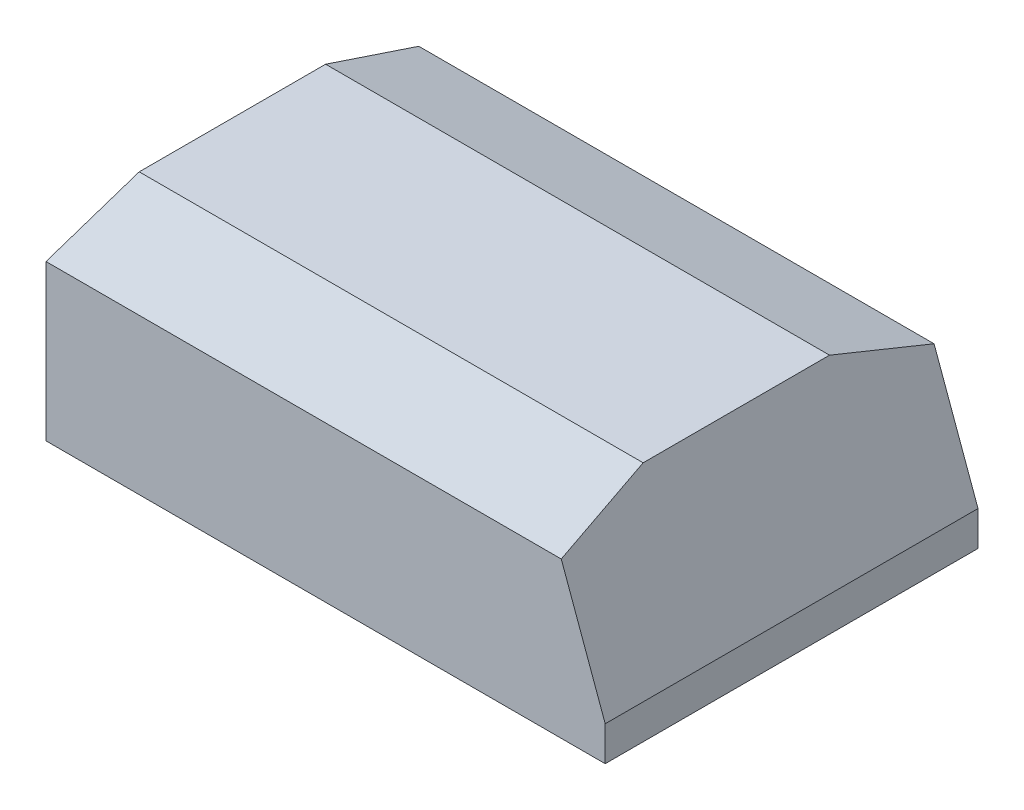
ISO-10303-21;
HEADER;
FILE_DESCRIPTION(('STEP AP214'),'2;1');
FILE_NAME('part.step','',(''),(''),'','','');
FILE_SCHEMA(('AUTOMOTIVE_DESIGN { 1 0 10303 214 1 1 1 1 }'));
ENDSEC;
DATA;
#1=APPLICATION_CONTEXT('core data for automotive mechanical design processes');
#2=APPLICATION_PROTOCOL_DEFINITION('international standard','automotive_design',2000,#1);
#3=PRODUCT_CONTEXT('',#1,'mechanical');
#4=PRODUCT('Part','Part','',(#3));
#5=PRODUCT_RELATED_PRODUCT_CATEGORY('part','',(#4));
#6=PRODUCT_DEFINITION_FORMATION('','',#4);
#7=PRODUCT_DEFINITION_CONTEXT('part definition',#1,'design');
#8=PRODUCT_DEFINITION('design','',#6,#7);
#9=PRODUCT_DEFINITION_SHAPE('','',#8);
#10=(LENGTH_UNIT() NAMED_UNIT(*) SI_UNIT(.MILLI.,.METRE.));
#11=(NAMED_UNIT(*) PLANE_ANGLE_UNIT() SI_UNIT($,.RADIAN.));
#12=(NAMED_UNIT(*) SI_UNIT($,.STERADIAN.) SOLID_ANGLE_UNIT());
#13=UNCERTAINTY_MEASURE_WITH_UNIT(LENGTH_MEASURE(1.E-05),#10,'distance_accuracy_value','');
#14=(GEOMETRIC_REPRESENTATION_CONTEXT(3) GLOBAL_UNCERTAINTY_ASSIGNED_CONTEXT((#13)) GLOBAL_UNIT_ASSIGNED_CONTEXT((#10,
#11,#12)) REPRESENTATION_CONTEXT('',''));
#15=CARTESIAN_POINT('',(0.,0.,0.));
#16=DIRECTION('',(0.,0.,1.));
#17=DIRECTION('',(1.,0.,0.));
#18=AXIS2_PLACEMENT_3D('',#15,#16,#17);
#19=CARTESIAN_POINT('',(45.,30.,-30.));
#20=DIRECTION('',(-1.,0.,0.));
#21=DIRECTION('',(0.,0.,1.));
#22=AXIS2_PLACEMENT_3D('',#19,#20,#21);
#23=PLANE('',#22);
#24=DIRECTION('',(0.,-1.,0.));
#25=VECTOR('',#24,1.);
#26=CARTESIAN_POINT('',(45.,30.,-30.));
#27=LINE('',#26,#25);
#28=CARTESIAN_POINT('',(45.,5.56799185956633,-30.));
#29=VERTEX_POINT('',#28);
#30=CARTESIAN_POINT('',(45.,0.,-30.));
#31=VERTEX_POINT('',#30);
#32=EDGE_CURVE('E137',#29,#31,#27,.T.);
#33=ORIENTED_EDGE('',*,*,#32,.F.);
#34=DIRECTION('',(0.,0.,1.));
#35=VECTOR('',#34,1.);
#36=CARTESIAN_POINT('',(45.,5.56799185956633,-30.));
#37=LINE('',#36,#35);
#38=CARTESIAN_POINT('',(45.,5.56799185956633,30.));
#39=VERTEX_POINT('',#38);
#40=EDGE_CURVE('E146',#29,#39,#37,.T.);
#41=ORIENTED_EDGE('',*,*,#40,.T.);
#42=DIRECTION('',(0.,-1.,0.));
#43=VECTOR('',#42,1.);
#44=CARTESIAN_POINT('',(45.,30.,30.));
#45=LINE('',#44,#43);
#46=CARTESIAN_POINT('',(45.,0.,30.));
#47=VERTEX_POINT('',#46);
#48=EDGE_CURVE('E120',#39,#47,#45,.T.);
#49=ORIENTED_EDGE('',*,*,#48,.T.);
#50=DIRECTION('',(0.,0.,-1.));
#51=VECTOR('',#50,1.);
#52=CARTESIAN_POINT('',(45.,0.,-30.));
#53=LINE('',#52,#51);
#54=EDGE_CURVE('E149',#47,#31,#53,.T.);
#55=ORIENTED_EDGE('',*,*,#54,.T.);
#56=EDGE_LOOP('',(#33,#41,#49,#55));
#57=FACE_BOUND('',#56,.T.);
#58=ADVANCED_FACE('F43',(#57),#23,.F.);
#59=CARTESIAN_POINT('',(-45.,30.,-30.));
#60=DIRECTION('',(0.,0.,1.));
#61=DIRECTION('',(1.,0.,0.));
#62=AXIS2_PLACEMENT_3D('',#59,#60,#61);
#63=PLANE('',#62);
#64=DIRECTION('',(0.,-1.,0.));
#65=VECTOR('',#64,1.);
#66=CARTESIAN_POINT('',(-45.,30.,-30.));
#67=LINE('',#66,#65);
#68=CARTESIAN_POINT('',(-45.,25.,-30.));
#69=VERTEX_POINT('',#68);
#70=CARTESIAN_POINT('',(-45.,0.,-30.));
#71=VERTEX_POINT('',#70);
#72=EDGE_CURVE('E135',#69,#71,#67,.T.);
#73=ORIENTED_EDGE('',*,*,#72,.F.);
#74=DIRECTION('',(-1.,0.,0.));
#75=VECTOR('',#74,1.);
#76=CARTESIAN_POINT('',(45.,25.,-30.));
#77=LINE('',#76,#75);
#78=CARTESIAN_POINT('',(37.9273274448638,25.,-30.));
#79=VERTEX_POINT('',#78);
#80=EDGE_CURVE('E175',#79,#69,#77,.T.);
#81=ORIENTED_EDGE('',*,*,#80,.F.);
#82=DIRECTION('',(0.342020143325663,-0.93969262078591,0.));
#83=VECTOR('',#82,1.);
#84=CARTESIAN_POINT('',(45.,5.56799185956633,-30.));
#85=LINE('',#84,#83);
#86=EDGE_CURVE('E144',#79,#29,#85,.T.);
#87=ORIENTED_EDGE('',*,*,#86,.T.);
#88=ORIENTED_EDGE('',*,*,#32,.T.);
#89=DIRECTION('',(-1.,0.,0.));
#90=VECTOR('',#89,1.);
#91=CARTESIAN_POINT('',(-45.,0.,-30.));
#92=LINE('',#91,#90);
#93=EDGE_CURVE('E130',#31,#71,#92,.T.);
#94=ORIENTED_EDGE('',*,*,#93,.T.);
#95=EDGE_LOOP('',(#73,#81,#87,#88,#94));
#96=FACE_BOUND('',#95,.T.);
#97=ADVANCED_FACE('F160',(#96),#63,.F.);
#98=CARTESIAN_POINT('',(-45.,30.,-30.));
#99=DIRECTION('',(1.,0.,0.));
#100=DIRECTION('',(0.,0.,-1.));
#101=AXIS2_PLACEMENT_3D('',#98,#99,#100);
#102=PLANE('',#101);
#103=DIRECTION('',(0.,-1.,0.));
#104=VECTOR('',#103,1.);
#105=CARTESIAN_POINT('',(-45.,30.,30.));
#106=LINE('',#105,#104);
#107=CARTESIAN_POINT('',(-45.,25.,30.));
#108=VERTEX_POINT('',#107);
#109=CARTESIAN_POINT('',(-45.,0.,30.));
#110=VERTEX_POINT('',#109);
#111=EDGE_CURVE('E115',#108,#110,#106,.T.);
#112=ORIENTED_EDGE('',*,*,#111,.F.);
#113=DIRECTION('',(0.,0.316227766016838,-0.948683298050514));
#114=VECTOR('',#113,1.);
#115=CARTESIAN_POINT('',(-45.,43.5,-25.5));
#116=LINE('',#115,#114);
#117=CARTESIAN_POINT('',(-45.,30.,15.));
#118=VERTEX_POINT('',#117);
#119=EDGE_CURVE('E103',#108,#118,#116,.T.);
#120=ORIENTED_EDGE('',*,*,#119,.T.);
#121=DIRECTION('',(0.,0.,1.));
#122=VECTOR('',#121,1.);
#123=CARTESIAN_POINT('',(-45.,30.,-30.));
#124=LINE('',#123,#122);
#125=CARTESIAN_POINT('',(-45.,30.,-15.));
#126=VERTEX_POINT('',#125);
#127=EDGE_CURVE('E46',#126,#118,#124,.T.);
#128=ORIENTED_EDGE('',*,*,#127,.F.);
#129=DIRECTION('',(0.,-0.316227766016838,-0.948683298050514));
#130=VECTOR('',#129,1.);
#131=CARTESIAN_POINT('',(-45.,25.5,-28.5));
#132=LINE('',#131,#130);
#133=EDGE_CURVE('E117',#126,#69,#132,.T.);
#134=ORIENTED_EDGE('',*,*,#133,.T.);
#135=ORIENTED_EDGE('',*,*,#72,.T.);
#136=DIRECTION('',(0.,0.,1.));
#137=VECTOR('',#136,1.);
#138=CARTESIAN_POINT('',(-45.,0.,-30.));
#139=LINE('',#138,#137);
#140=EDGE_CURVE('E124',#71,#110,#139,.T.);
#141=ORIENTED_EDGE('',*,*,#140,.T.);
#142=EDGE_LOOP('',(#112,#120,#128,#134,#135,#141));
#143=FACE_BOUND('',#142,.T.);
#144=ADVANCED_FACE('F112',(#143),#102,.F.);
#145=CARTESIAN_POINT('',(-45.,30.,30.));
#146=DIRECTION('',(0.,0.,-1.));
#147=DIRECTION('',(-1.,0.,0.));
#148=AXIS2_PLACEMENT_3D('',#145,#146,#147);
#149=PLANE('',#148);
#150=DIRECTION('',(0.342020143325663,-0.93969262078591,0.));
#151=VECTOR('',#150,1.);
#152=CARTESIAN_POINT('',(45.,5.56799185956633,30.));
#153=LINE('',#152,#151);
#154=CARTESIAN_POINT('',(37.9273274448638,25.,30.));
#155=VERTEX_POINT('',#154);
#156=EDGE_CURVE('E116',#155,#39,#153,.T.);
#157=ORIENTED_EDGE('',*,*,#156,.F.);
#158=DIRECTION('',(-1.,0.,0.));
#159=VECTOR('',#158,1.);
#160=CARTESIAN_POINT('',(45.,25.,30.));
#161=LINE('',#160,#159);
#162=EDGE_CURVE('E59',#155,#108,#161,.T.);
#163=ORIENTED_EDGE('',*,*,#162,.T.);
#164=ORIENTED_EDGE('',*,*,#111,.T.);
#165=DIRECTION('',(1.,0.,0.));
#166=VECTOR('',#165,1.);
#167=CARTESIAN_POINT('',(-45.,0.,30.));
#168=LINE('',#167,#166);
#169=EDGE_CURVE('E121',#110,#47,#168,.T.);
#170=ORIENTED_EDGE('',*,*,#169,.T.);
#171=ORIENTED_EDGE('',*,*,#48,.F.);
#172=EDGE_LOOP('',(#157,#163,#164,#170,#171));
#173=FACE_BOUND('',#172,.T.);
#174=ADVANCED_FACE('F179',(#173),#149,.F.);
#175=CARTESIAN_POINT('',(0.,30.,0.));
#176=DIRECTION('',(0.,1.,0.));
#177=DIRECTION('',(0.,0.,1.));
#178=AXIS2_PLACEMENT_3D('',#175,#176,#177);
#179=PLANE('',#178);
#180=DIRECTION('',(-1.,0.,0.));
#181=VECTOR('',#180,1.);
#182=CARTESIAN_POINT('',(45.,30.,15.));
#183=LINE('',#182,#181);
#184=CARTESIAN_POINT('',(36.1074762735328,30.,15.));
#185=VERTEX_POINT('',#184);
#186=EDGE_CURVE('E100',#185,#118,#183,.T.);
#187=ORIENTED_EDGE('',*,*,#186,.F.);
#188=DIRECTION('',(0.,0.,1.));
#189=VECTOR('',#188,1.);
#190=CARTESIAN_POINT('',(36.1074762735328,30.,-30.));
#191=LINE('',#190,#189);
#192=CARTESIAN_POINT('',(36.1074762735328,30.,-15.));
#193=VERTEX_POINT('',#192);
#194=EDGE_CURVE('E142',#193,#185,#191,.T.);
#195=ORIENTED_EDGE('',*,*,#194,.F.);
#196=DIRECTION('',(-1.,0.,0.));
#197=VECTOR('',#196,1.);
#198=CARTESIAN_POINT('',(45.,30.,-15.));
#199=LINE('',#198,#197);
#200=EDGE_CURVE('E66',#193,#126,#199,.T.);
#201=ORIENTED_EDGE('',*,*,#200,.T.);
#202=ORIENTED_EDGE('',*,*,#127,.T.);
#203=EDGE_LOOP('',(#187,#195,#201,#202));
#204=FACE_BOUND('',#203,.T.);
#205=ADVANCED_FACE('F119',(#204),#179,.T.);
#206=CARTESIAN_POINT('',(0.,0.,0.));
#207=DIRECTION('',(0.,1.,0.));
#208=DIRECTION('',(0.,0.,1.));
#209=AXIS2_PLACEMENT_3D('',#206,#207,#208);
#210=PLANE('',#209);
#211=ORIENTED_EDGE('',*,*,#54,.F.);
#212=ORIENTED_EDGE('',*,*,#169,.F.);
#213=ORIENTED_EDGE('',*,*,#140,.F.);
#214=ORIENTED_EDGE('',*,*,#93,.F.);
#215=EDGE_LOOP('',(#211,#212,#213,#214));
#216=FACE_BOUND('',#215,.T.);
#217=ADVANCED_FACE('F163',(#216),#210,.F.);
#218=CARTESIAN_POINT('',(45.,5.56799185956633,-30.));
#219=DIRECTION('',(-0.93969262078591,-0.342020143325663,0.));
#220=DIRECTION('',(0.342020143325663,-0.939692620785911,0.));
#221=AXIS2_PLACEMENT_3D('',#218,#219,#220);
#222=PLANE('',#221);
#223=ORIENTED_EDGE('',*,*,#194,.T.);
#224=DIRECTION('',(0.114342612853221,-0.314153746895672,0.942461240687015));
#225=VECTOR('',#224,1.);
#226=CARTESIAN_POINT('',(32.2520086467479,40.59281024603,-16.7784307380899));
#227=LINE('',#226,#225);
#228=EDGE_CURVE('E11',#185,#155,#227,.T.);
#229=ORIENTED_EDGE('',*,*,#228,.T.);
#230=ORIENTED_EDGE('',*,*,#156,.T.);
#231=ORIENTED_EDGE('',*,*,#40,.F.);
#232=ORIENTED_EDGE('',*,*,#86,.F.);
#233=DIRECTION('',(-0.114342612853221,0.314153746895672,0.942461240687015));
#234=VECTOR('',#233,1.);
#235=CARTESIAN_POINT('',(38.7178174931304,22.8281464420838,-36.5155606737486));
#236=LINE('',#235,#234);
#237=EDGE_CURVE('E52',#79,#193,#236,.T.);
#238=ORIENTED_EDGE('',*,*,#237,.T.);
#239=EDGE_LOOP('',(#223,#229,#230,#231,#232,#238));
#240=FACE_BOUND('',#239,.T.);
#241=ADVANCED_FACE('F141',(#240),#222,.F.);
#242=CARTESIAN_POINT('',(45.,30.,-15.));
#243=DIRECTION('',(0.,-0.948683298050514,0.316227766016838));
#244=DIRECTION('',(0.,-0.316227766016838,-0.948683298050514));
#245=AXIS2_PLACEMENT_3D('',#242,#243,#244);
#246=PLANE('',#245);
#247=ORIENTED_EDGE('',*,*,#200,.F.);
#248=ORIENTED_EDGE('',*,*,#237,.F.);
#249=ORIENTED_EDGE('',*,*,#80,.T.);
#250=ORIENTED_EDGE('',*,*,#133,.F.);
#251=EDGE_LOOP('',(#247,#248,#249,#250));
#252=FACE_BOUND('',#251,.T.);
#253=ADVANCED_FACE('F176',(#252),#246,.F.);
#254=CARTESIAN_POINT('',(45.,30.,15.));
#255=DIRECTION('',(0.,-0.948683298050514,-0.316227766016838));
#256=DIRECTION('',(0.,0.316227766016838,-0.948683298050514));
#257=AXIS2_PLACEMENT_3D('',#254,#255,#256);
#258=PLANE('',#257);
#259=ORIENTED_EDGE('',*,*,#162,.F.);
#260=ORIENTED_EDGE('',*,*,#228,.F.);
#261=ORIENTED_EDGE('',*,*,#186,.T.);
#262=ORIENTED_EDGE('',*,*,#119,.F.);
#263=EDGE_LOOP('',(#259,#260,#261,#262));
#264=FACE_BOUND('',#263,.T.);
#265=ADVANCED_FACE('F102',(#264),#258,.F.);
#266=CLOSED_SHELL('',(#58,#97,#144,#174,#205,#217,#241,#253,#265));
#267=MANIFOLD_SOLID_BREP('B2',#266);
#268=ADVANCED_BREP_SHAPE_REPRESENTATION('',(#18,#267),#14);
#269=SHAPE_DEFINITION_REPRESENTATION(#9,#268);
ENDSEC;
END-ISO-10303-21;
